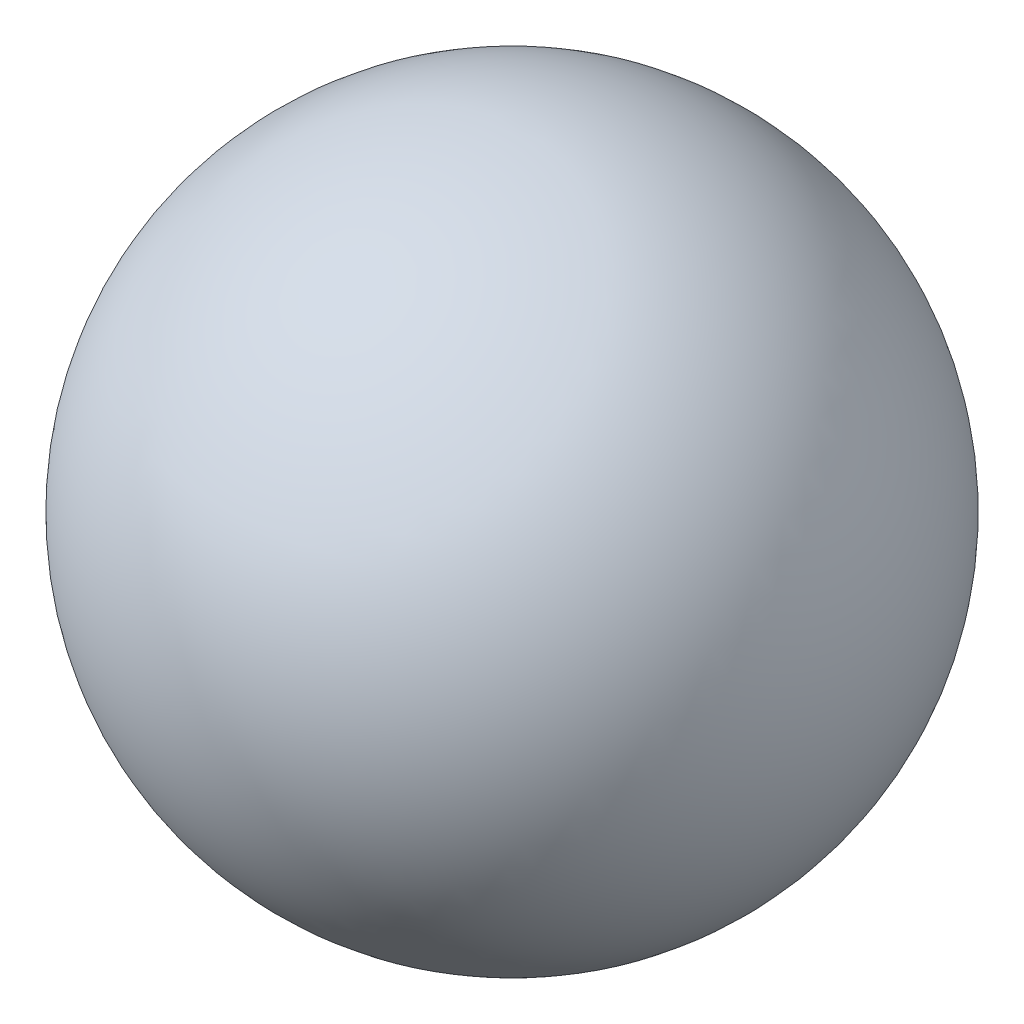
ISO-10303-21;
HEADER;
FILE_DESCRIPTION(('STEP AP214'),'2;1');
FILE_NAME('part.step','',(''),(''),'','','');
FILE_SCHEMA(('AUTOMOTIVE_DESIGN { 1 0 10303 214 1 1 1 1 }'));
ENDSEC;
DATA;
#1=APPLICATION_CONTEXT('core data for automotive mechanical design processes');
#2=APPLICATION_PROTOCOL_DEFINITION('international standard','automotive_design',2000,#1);
#3=PRODUCT_CONTEXT('',#1,'mechanical');
#4=PRODUCT('Part','Part','',(#3));
#5=PRODUCT_RELATED_PRODUCT_CATEGORY('part','',(#4));
#6=PRODUCT_DEFINITION_FORMATION('','',#4);
#7=PRODUCT_DEFINITION_CONTEXT('part definition',#1,'design');
#8=PRODUCT_DEFINITION('design','',#6,#7);
#9=PRODUCT_DEFINITION_SHAPE('','',#8);
#10=(LENGTH_UNIT() NAMED_UNIT(*) SI_UNIT(.MILLI.,.METRE.));
#11=(NAMED_UNIT(*) PLANE_ANGLE_UNIT() SI_UNIT($,.RADIAN.));
#12=(NAMED_UNIT(*) SI_UNIT($,.STERADIAN.) SOLID_ANGLE_UNIT());
#13=UNCERTAINTY_MEASURE_WITH_UNIT(LENGTH_MEASURE(1.E-05),#10,'distance_accuracy_value','');
#14=(GEOMETRIC_REPRESENTATION_CONTEXT(3) GLOBAL_UNCERTAINTY_ASSIGNED_CONTEXT((#13)) GLOBAL_UNIT_ASSIGNED_CONTEXT((#10,
#11,#12)) REPRESENTATION_CONTEXT('',''));
#15=CARTESIAN_POINT('',(0.,0.,0.));
#16=DIRECTION('',(0.,0.,1.));
#17=DIRECTION('',(1.,0.,0.));
#18=AXIS2_PLACEMENT_3D('',#15,#16,#17);
#19=CARTESIAN_POINT('',(0.,0.,0.));
#20=DIRECTION('',(0.,1.,0.));
#21=DIRECTION('',(1.,0.,0.));
#22=AXIS2_PLACEMENT_3D('',#19,#20,#21);
#23=SPHERICAL_SURFACE('',#22,30.);
#24=CARTESIAN_POINT('',(0.,30.,0.));
#25=VERTEX_POINT('',#24);
#26=VERTEX_LOOP('',#25);
#27=FACE_BOUND('',#26,.T.);
#28=ADVANCED_FACE('F36',(#27),#23,.T.);
#29=CLOSED_SHELL('',(#28));
#30=MANIFOLD_SOLID_BREP('B2',#29);
#31=ADVANCED_BREP_SHAPE_REPRESENTATION('',(#18,#30),#14);
#32=SHAPE_DEFINITION_REPRESENTATION(#9,#31);
ENDSEC;
END-ISO-10303-21;
